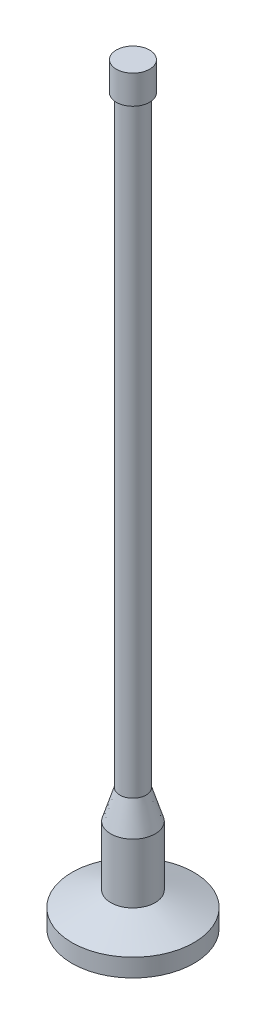
ISO-10303-21;
HEADER;
FILE_DESCRIPTION(('STEP AP214'),'2;1');
FILE_NAME('part.step','',(''),(''),'','','');
FILE_SCHEMA(('AUTOMOTIVE_DESIGN { 1 0 10303 214 1 1 1 1 }'));
ENDSEC;
DATA;
#1=APPLICATION_CONTEXT('core data for automotive mechanical design processes');
#2=APPLICATION_PROTOCOL_DEFINITION('international standard','automotive_design',2000,#1);
#3=PRODUCT_CONTEXT('',#1,'mechanical');
#4=PRODUCT('Part','Part','',(#3));
#5=PRODUCT_RELATED_PRODUCT_CATEGORY('part','',(#4));
#6=PRODUCT_DEFINITION_FORMATION('','',#4);
#7=PRODUCT_DEFINITION_CONTEXT('part definition',#1,'design');
#8=PRODUCT_DEFINITION('design','',#6,#7);
#9=PRODUCT_DEFINITION_SHAPE('','',#8);
#10=(LENGTH_UNIT() NAMED_UNIT(*) SI_UNIT(.MILLI.,.METRE.));
#11=(NAMED_UNIT(*) PLANE_ANGLE_UNIT() SI_UNIT($,.RADIAN.));
#12=(NAMED_UNIT(*) SI_UNIT($,.STERADIAN.) SOLID_ANGLE_UNIT());
#13=UNCERTAINTY_MEASURE_WITH_UNIT(LENGTH_MEASURE(1.E-05),#10,'distance_accuracy_value','');
#14=(GEOMETRIC_REPRESENTATION_CONTEXT(3) GLOBAL_UNCERTAINTY_ASSIGNED_CONTEXT((#13)) GLOBAL_UNIT_ASSIGNED_CONTEXT((#10,
#11,#12)) REPRESENTATION_CONTEXT('',''));
#15=CARTESIAN_POINT('',(0.,0.,0.));
#16=DIRECTION('',(0.,0.,1.));
#17=DIRECTION('',(1.,0.,0.));
#18=AXIS2_PLACEMENT_3D('',#15,#16,#17);
#19=CARTESIAN_POINT('',(0.,0.,0.));
#20=DIRECTION('',(0.,1.,0.));
#21=DIRECTION('',(0.,0.,1.));
#22=AXIS2_PLACEMENT_3D('',#19,#20,#21);
#23=PLANE('',#22);
#24=CARTESIAN_POINT('',(0.,0.,0.));
#25=DIRECTION('',(0.,1.,0.));
#26=DIRECTION('',(0.,0.,1.));
#27=AXIS2_PLACEMENT_3D('',#24,#25,#26);
#28=CIRCLE('',#27,44.);
#29=CARTESIAN_POINT('',(0.,0.,44.));
#30=VERTEX_POINT('',#29);
#31=EDGE_CURVE('E10',#30,#30,#28,.T.);
#32=ORIENTED_EDGE('',*,*,#31,.F.);
#33=EDGE_LOOP('',(#32));
#34=FACE_BOUND('',#33,.T.);
#35=ADVANCED_FACE('F37',(#34),#23,.F.);
#36=CARTESIAN_POINT('',(0.,289.396314171452,0.));
#37=DIRECTION('',(0.,1.,0.));
#38=DIRECTION('',(0.,0.,1.));
#39=AXIS2_PLACEMENT_3D('',#36,#37,#38);
#40=CYLINDRICAL_SURFACE('',#39,44.);
#41=CARTESIAN_POINT('',(0.,13.,0.));
#42=DIRECTION('',(0.,1.,0.));
#43=DIRECTION('',(0.,0.,1.));
#44=AXIS2_PLACEMENT_3D('',#41,#42,#43);
#45=CIRCLE('',#44,44.);
#46=CARTESIAN_POINT('',(0.,13.,44.));
#47=VERTEX_POINT('',#46);
#48=EDGE_CURVE('E44',#47,#47,#45,.T.);
#49=ORIENTED_EDGE('',*,*,#48,.F.);
#50=EDGE_LOOP('',(#49));
#51=FACE_BOUND('',#50,.T.);
#52=ORIENTED_EDGE('',*,*,#31,.T.);
#53=EDGE_LOOP('',(#52));
#54=FACE_BOUND('',#53,.T.);
#55=ADVANCED_FACE('F111',(#51,#54),#40,.T.);
#56=CARTESIAN_POINT('',(0.,13.,0.));
#57=DIRECTION('',(0.,-1.,0.));
#58=DIRECTION('',(0.,0.,-1.));
#59=AXIS2_PLACEMENT_3D('',#56,#57,#58);
#60=CONICAL_SURFACE('',#59,44.,1.19646271078731);
#61=CARTESIAN_POINT('',(0.,24.,0.));
#62=DIRECTION('',(0.,1.,0.));
#63=DIRECTION('',(0.,0.,1.));
#64=AXIS2_PLACEMENT_3D('',#61,#62,#63);
#65=CIRCLE('',#64,16.);
#66=CARTESIAN_POINT('',(0.,24.,16.));
#67=VERTEX_POINT('',#66);
#68=EDGE_CURVE('E49',#67,#67,#65,.T.);
#69=ORIENTED_EDGE('',*,*,#68,.F.);
#70=EDGE_LOOP('',(#69));
#71=FACE_BOUND('',#70,.T.);
#72=ORIENTED_EDGE('',*,*,#48,.T.);
#73=EDGE_LOOP('',(#72));
#74=FACE_BOUND('',#73,.T.);
#75=ADVANCED_FACE('F106',(#71,#74),#60,.T.);
#76=CARTESIAN_POINT('',(0.,289.396314171452,0.));
#77=DIRECTION('',(0.,1.,0.));
#78=DIRECTION('',(0.,0.,1.));
#79=AXIS2_PLACEMENT_3D('',#76,#77,#78);
#80=CYLINDRICAL_SURFACE('',#79,16.);
#81=CARTESIAN_POINT('',(0.,67.,0.));
#82=DIRECTION('',(0.,1.,0.));
#83=DIRECTION('',(0.,0.,1.));
#84=AXIS2_PLACEMENT_3D('',#81,#82,#83);
#85=CIRCLE('',#84,16.);
#86=CARTESIAN_POINT('',(0.,67.,16.));
#87=VERTEX_POINT('',#86);
#88=EDGE_CURVE('E54',#87,#87,#85,.T.);
#89=ORIENTED_EDGE('',*,*,#88,.F.);
#90=EDGE_LOOP('',(#89));
#91=FACE_BOUND('',#90,.T.);
#92=ORIENTED_EDGE('',*,*,#68,.T.);
#93=EDGE_LOOP('',(#92));
#94=FACE_BOUND('',#93,.T.);
#95=ADVANCED_FACE('F100',(#91,#94),#80,.T.);
#96=CARTESIAN_POINT('',(0.,67.,0.));
#97=DIRECTION('',(0.,-1.,0.));
#98=DIRECTION('',(0.,0.,-1.));
#99=AXIS2_PLACEMENT_3D('',#96,#97,#98);
#100=CONICAL_SURFACE('',#99,16.,0.300171170830113);
#101=CARTESIAN_POINT('',(0.,88.,0.));
#102=DIRECTION('',(0.,1.,0.));
#103=DIRECTION('',(0.,0.,1.));
#104=AXIS2_PLACEMENT_3D('',#101,#102,#103);
#105=CIRCLE('',#104,9.50000000000002);
#106=CARTESIAN_POINT('',(0.,88.,9.50000000000002));
#107=VERTEX_POINT('',#106);
#108=EDGE_CURVE('E60',#107,#107,#105,.T.);
#109=ORIENTED_EDGE('',*,*,#108,.F.);
#110=EDGE_LOOP('',(#109));
#111=FACE_BOUND('',#110,.T.);
#112=ORIENTED_EDGE('',*,*,#88,.T.);
#113=EDGE_LOOP('',(#112));
#114=FACE_BOUND('',#113,.T.);
#115=ADVANCED_FACE('F94',(#111,#114),#100,.T.);
#116=CARTESIAN_POINT('',(0.,289.396314171452,0.));
#117=DIRECTION('',(0.,1.,0.));
#118=DIRECTION('',(0.,0.,1.));
#119=AXIS2_PLACEMENT_3D('',#116,#117,#118);
#120=CYLINDRICAL_SURFACE('',#119,9.50000000000002);
#121=CARTESIAN_POINT('',(0.,522.2875,0.));
#122=DIRECTION('',(0.,1.,0.));
#123=DIRECTION('',(0.,0.,1.));
#124=AXIS2_PLACEMENT_3D('',#121,#122,#123);
#125=CIRCLE('',#124,9.50000000000002);
#126=CARTESIAN_POINT('',(0.,522.2875,9.50000000000002));
#127=VERTEX_POINT('',#126);
#128=EDGE_CURVE('E64',#127,#127,#125,.T.);
#129=ORIENTED_EDGE('',*,*,#128,.F.);
#130=EDGE_LOOP('',(#129));
#131=FACE_BOUND('',#130,.T.);
#132=ORIENTED_EDGE('',*,*,#108,.T.);
#133=EDGE_LOOP('',(#132));
#134=FACE_BOUND('',#133,.T.);
#135=ADVANCED_FACE('F88',(#131,#134),#120,.T.);
#136=CARTESIAN_POINT('',(9.50000000000002,522.2875,0.));
#137=DIRECTION('',(0.,1.,0.));
#138=DIRECTION('',(0.,0.,1.));
#139=AXIS2_PLACEMENT_3D('',#136,#137,#138);
#140=PLANE('',#139);
#141=CARTESIAN_POINT('',(0.,522.2875,0.));
#142=DIRECTION('',(0.,1.,0.));
#143=DIRECTION('',(0.,0.,1.));
#144=AXIS2_PLACEMENT_3D('',#141,#142,#143);
#145=CIRCLE('',#144,12.);
#146=CARTESIAN_POINT('',(0.,522.2875,12.));
#147=VERTEX_POINT('',#146);
#148=EDGE_CURVE('E68',#147,#147,#145,.T.);
#149=ORIENTED_EDGE('',*,*,#148,.F.);
#150=EDGE_LOOP('',(#149));
#151=FACE_BOUND('',#150,.T.);
#152=ORIENTED_EDGE('',*,*,#128,.T.);
#153=EDGE_LOOP('',(#152));
#154=FACE_BOUND('',#153,.T.);
#155=ADVANCED_FACE('F82',(#151,#154),#140,.F.);
#156=CARTESIAN_POINT('',(0.,289.396314171452,0.));
#157=DIRECTION('',(0.,1.,0.));
#158=DIRECTION('',(0.,0.,1.));
#159=AXIS2_PLACEMENT_3D('',#156,#157,#158);
#160=CYLINDRICAL_SURFACE('',#159,12.);
#161=CARTESIAN_POINT('',(0.,543.,0.));
#162=DIRECTION('',(0.,1.,0.));
#163=DIRECTION('',(0.,0.,1.));
#164=AXIS2_PLACEMENT_3D('',#161,#162,#163);
#165=CIRCLE('',#164,12.);
#166=CARTESIAN_POINT('',(0.,543.,12.));
#167=VERTEX_POINT('',#166);
#168=EDGE_CURVE('E72',#167,#167,#165,.T.);
#169=ORIENTED_EDGE('',*,*,#168,.F.);
#170=EDGE_LOOP('',(#169));
#171=FACE_BOUND('',#170,.T.);
#172=ORIENTED_EDGE('',*,*,#148,.T.);
#173=EDGE_LOOP('',(#172));
#174=FACE_BOUND('',#173,.T.);
#175=ADVANCED_FACE('F79',(#171,#174),#160,.T.);
#176=CARTESIAN_POINT('',(12.,543.,0.));
#177=DIRECTION('',(0.,-1.,0.));
#178=DIRECTION('',(0.,0.,-1.));
#179=AXIS2_PLACEMENT_3D('',#176,#177,#178);
#180=PLANE('',#179);
#181=ORIENTED_EDGE('',*,*,#168,.T.);
#182=EDGE_LOOP('',(#181));
#183=FACE_BOUND('',#182,.T.);
#184=ADVANCED_FACE('F77',(#183),#180,.F.);
#185=CLOSED_SHELL('',(#35,#55,#75,#95,#115,#135,#155,#175,#184));
#186=MANIFOLD_SOLID_BREP('B2',#185);
#187=ADVANCED_BREP_SHAPE_REPRESENTATION('',(#18,#186),#14);
#188=SHAPE_DEFINITION_REPRESENTATION(#9,#187);
ENDSEC;
END-ISO-10303-21;
